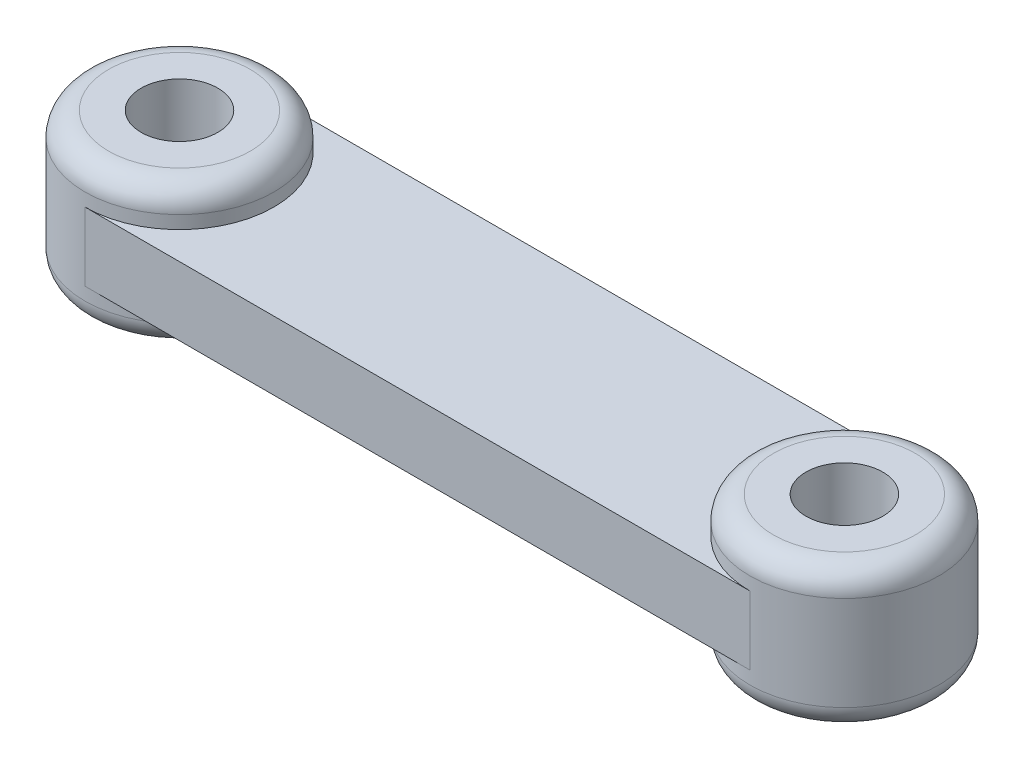
ISO-10303-21;
HEADER;
FILE_DESCRIPTION(('STEP AP214'),'2;1');
FILE_NAME('part.step','',(''),(''),'','','');
FILE_SCHEMA(('AUTOMOTIVE_DESIGN { 1 0 10303 214 1 1 1 1 }'));
ENDSEC;
DATA;
#1=APPLICATION_CONTEXT('core data for automotive mechanical design processes');
#2=APPLICATION_PROTOCOL_DEFINITION('international standard','automotive_design',2000,#1);
#3=PRODUCT_CONTEXT('',#1,'mechanical');
#4=PRODUCT('Part','Part','',(#3));
#5=PRODUCT_RELATED_PRODUCT_CATEGORY('part','',(#4));
#6=PRODUCT_DEFINITION_FORMATION('','',#4);
#7=PRODUCT_DEFINITION_CONTEXT('part definition',#1,'design');
#8=PRODUCT_DEFINITION('design','',#6,#7);
#9=PRODUCT_DEFINITION_SHAPE('','',#8);
#10=(LENGTH_UNIT() NAMED_UNIT(*) SI_UNIT(.MILLI.,.METRE.));
#11=(NAMED_UNIT(*) PLANE_ANGLE_UNIT() SI_UNIT($,.RADIAN.));
#12=(NAMED_UNIT(*) SI_UNIT($,.STERADIAN.) SOLID_ANGLE_UNIT());
#13=UNCERTAINTY_MEASURE_WITH_UNIT(LENGTH_MEASURE(1.E-05),#10,'distance_accuracy_value','');
#14=(GEOMETRIC_REPRESENTATION_CONTEXT(3) GLOBAL_UNCERTAINTY_ASSIGNED_CONTEXT((#13)) GLOBAL_UNIT_ASSIGNED_CONTEXT((#10,
#11,#12)) REPRESENTATION_CONTEXT('',''));
#15=CARTESIAN_POINT('',(0.,0.,0.));
#16=DIRECTION('',(0.,0.,1.));
#17=DIRECTION('',(1.,0.,0.));
#18=AXIS2_PLACEMENT_3D('',#15,#16,#17);
#19=CARTESIAN_POINT('',(-14.075,1.45,0.));
#20=DIRECTION('',(0.,1.,0.));
#21=DIRECTION('',(0.,0.,1.));
#22=AXIS2_PLACEMENT_3D('',#19,#20,#21);
#23=PLANE('',#22);
#24=DIRECTION('',(1.,0.,0.));
#25=VECTOR('',#24,1.);
#26=CARTESIAN_POINT('',(-14.075,1.45,4.));
#27=LINE('',#26,#25);
#28=CARTESIAN_POINT('',(-14.075,1.45,4.));
#29=VERTEX_POINT('',#28);
#30=CARTESIAN_POINT('',(14.075,1.45,3.99999999999999));
#31=VERTEX_POINT('',#30);
#32=EDGE_CURVE('E57',#29,#31,#27,.T.);
#33=ORIENTED_EDGE('',*,*,#32,.T.);
#34=CARTESIAN_POINT('',(14.075,1.45,0.));
#35=DIRECTION('',(0.,1.,0.));
#36=DIRECTION('',(0.,0.,1.));
#37=AXIS2_PLACEMENT_3D('',#34,#35,#36);
#38=CIRCLE('',#37,4.);
#39=CARTESIAN_POINT('',(14.075,1.45,-4.));
#40=VERTEX_POINT('',#39);
#41=EDGE_CURVE('E106',#31,#40,#38,.F.);
#42=ORIENTED_EDGE('',*,*,#41,.T.);
#43=DIRECTION('',(-1.,0.,0.));
#44=VECTOR('',#43,1.);
#45=CARTESIAN_POINT('',(-14.075,1.45,-4.));
#46=LINE('',#45,#44);
#47=CARTESIAN_POINT('',(-14.075,1.45,-4.));
#48=VERTEX_POINT('',#47);
#49=EDGE_CURVE('E161',#40,#48,#46,.T.);
#50=ORIENTED_EDGE('',*,*,#49,.T.);
#51=CARTESIAN_POINT('',(-14.075,1.45,0.));
#52=DIRECTION('',(0.,1.,0.));
#53=DIRECTION('',(0.,0.,1.));
#54=AXIS2_PLACEMENT_3D('',#51,#52,#53);
#55=CIRCLE('',#54,4.);
#56=EDGE_CURVE('E76',#48,#29,#55,.F.);
#57=ORIENTED_EDGE('',*,*,#56,.T.);
#58=EDGE_LOOP('',(#33,#42,#50,#57));
#59=FACE_BOUND('',#58,.T.);
#60=ADVANCED_FACE('F39',(#59),#23,.T.);
#61=CARTESIAN_POINT('',(-14.075,-1.45,0.));
#62=DIRECTION('',(0.,1.,0.));
#63=DIRECTION('',(0.,0.,1.));
#64=AXIS2_PLACEMENT_3D('',#61,#62,#63);
#65=PLANE('',#64);
#66=CARTESIAN_POINT('',(14.075,-1.45,0.));
#67=DIRECTION('',(0.,1.,0.));
#68=DIRECTION('',(0.,0.,1.));
#69=AXIS2_PLACEMENT_3D('',#66,#67,#68);
#70=CIRCLE('',#69,4.);
#71=CARTESIAN_POINT('',(14.075,-1.45,3.99999999999999));
#72=VERTEX_POINT('',#71);
#73=CARTESIAN_POINT('',(14.075,-1.45,-4.));
#74=VERTEX_POINT('',#73);
#75=EDGE_CURVE('E68',#72,#74,#70,.F.);
#76=ORIENTED_EDGE('',*,*,#75,.F.);
#77=DIRECTION('',(1.,0.,0.));
#78=VECTOR('',#77,1.);
#79=CARTESIAN_POINT('',(-14.075,-1.45,4.));
#80=LINE('',#79,#78);
#81=CARTESIAN_POINT('',(-14.075,-1.45,4.));
#82=VERTEX_POINT('',#81);
#83=EDGE_CURVE('E90',#82,#72,#80,.T.);
#84=ORIENTED_EDGE('',*,*,#83,.F.);
#85=CARTESIAN_POINT('',(-14.075,-1.45,0.));
#86=DIRECTION('',(0.,1.,0.));
#87=DIRECTION('',(0.,0.,1.));
#88=AXIS2_PLACEMENT_3D('',#85,#86,#87);
#89=CIRCLE('',#88,4.);
#90=CARTESIAN_POINT('',(-14.075,-1.45,-4.));
#91=VERTEX_POINT('',#90);
#92=EDGE_CURVE('E96',#91,#82,#89,.F.);
#93=ORIENTED_EDGE('',*,*,#92,.F.);
#94=DIRECTION('',(-1.,0.,0.));
#95=VECTOR('',#94,1.);
#96=CARTESIAN_POINT('',(-14.075,-1.45,-4.));
#97=LINE('',#96,#95);
#98=EDGE_CURVE('E93',#74,#91,#97,.T.);
#99=ORIENTED_EDGE('',*,*,#98,.F.);
#100=EDGE_LOOP('',(#76,#84,#93,#99));
#101=FACE_BOUND('',#100,.T.);
#102=ADVANCED_FACE('F89',(#101),#65,.F.);
#103=CARTESIAN_POINT('',(-14.075,1.45,0.));
#104=DIRECTION('',(0.,-1.,0.));
#105=DIRECTION('',(0.,0.,-1.));
#106=AXIS2_PLACEMENT_3D('',#103,#104,#105);
#107=CYLINDRICAL_SURFACE('',#106,4.);
#108=CARTESIAN_POINT('',(-14.075,-2.,0.));
#109=DIRECTION('',(0.,1.,0.));
#110=DIRECTION('',(0.,0.,1.));
#111=AXIS2_PLACEMENT_3D('',#108,#109,#110);
#112=CIRCLE('',#111,4.);
#113=CARTESIAN_POINT('',(-14.075,-2.,4.));
#114=VERTEX_POINT('',#113);
#115=EDGE_CURVE('E138',#114,#114,#112,.T.);
#116=ORIENTED_EDGE('',*,*,#115,.T.);
#117=EDGE_LOOP('',(#116));
#118=FACE_BOUND('',#117,.T.);
#119=CARTESIAN_POINT('',(-14.075,2.,0.));
#120=DIRECTION('',(0.,1.,0.));
#121=DIRECTION('',(0.,0.,1.));
#122=AXIS2_PLACEMENT_3D('',#119,#120,#121);
#123=CIRCLE('',#122,4.);
#124=CARTESIAN_POINT('',(-14.075,2.,4.));
#125=VERTEX_POINT('',#124);
#126=EDGE_CURVE('E134',#125,#125,#123,.F.);
#127=ORIENTED_EDGE('',*,*,#126,.T.);
#128=EDGE_LOOP('',(#127));
#129=FACE_BOUND('',#128,.T.);
#130=DIRECTION('',(0.,-1.,0.));
#131=VECTOR('',#130,1.);
#132=CARTESIAN_POINT('',(-14.075,1.45,-4.));
#133=LINE('',#132,#131);
#134=EDGE_CURVE('E113',#48,#91,#133,.T.);
#135=ORIENTED_EDGE('',*,*,#134,.T.);
#136=ORIENTED_EDGE('',*,*,#92,.T.);
#137=DIRECTION('',(0.,-1.,0.));
#138=VECTOR('',#137,1.);
#139=CARTESIAN_POINT('',(-14.075,1.45,4.));
#140=LINE('',#139,#138);
#141=EDGE_CURVE('E102',#29,#82,#140,.T.);
#142=ORIENTED_EDGE('',*,*,#141,.F.);
#143=ORIENTED_EDGE('',*,*,#56,.F.);
#144=EDGE_LOOP('',(#135,#136,#142,#143));
#145=FACE_BOUND('',#144,.T.);
#146=ADVANCED_FACE('F153',(#118,#129,#145),#107,.T.);
#147=CARTESIAN_POINT('',(-14.075,1.45,4.));
#148=DIRECTION('',(0.,0.,-1.));
#149=DIRECTION('',(-1.,0.,0.));
#150=AXIS2_PLACEMENT_3D('',#147,#148,#149);
#151=PLANE('',#150);
#152=ORIENTED_EDGE('',*,*,#83,.T.);
#153=DIRECTION('',(0.,-1.,0.));
#154=VECTOR('',#153,1.);
#155=CARTESIAN_POINT('',(14.075,1.45,3.99999999999999));
#156=LINE('',#155,#154);
#157=EDGE_CURVE('E100',#31,#72,#156,.T.);
#158=ORIENTED_EDGE('',*,*,#157,.F.);
#159=ORIENTED_EDGE('',*,*,#32,.F.);
#160=ORIENTED_EDGE('',*,*,#141,.T.);
#161=EDGE_LOOP('',(#152,#158,#159,#160));
#162=FACE_BOUND('',#161,.T.);
#163=ADVANCED_FACE('F99',(#162),#151,.F.);
#164=CARTESIAN_POINT('',(14.075,1.45,0.));
#165=DIRECTION('',(0.,-1.,0.));
#166=DIRECTION('',(0.,0.,-1.));
#167=AXIS2_PLACEMENT_3D('',#164,#165,#166);
#168=CYLINDRICAL_SURFACE('',#167,4.);
#169=CARTESIAN_POINT('',(14.075,2.,0.));
#170=DIRECTION('',(0.,1.,0.));
#171=DIRECTION('',(0.,0.,1.));
#172=AXIS2_PLACEMENT_3D('',#169,#170,#171);
#173=CIRCLE('',#172,4.);
#174=CARTESIAN_POINT('',(14.075,2.,3.99999999999999));
#175=VERTEX_POINT('',#174);
#176=EDGE_CURVE('E126',#175,#175,#173,.F.);
#177=ORIENTED_EDGE('',*,*,#176,.T.);
#178=EDGE_LOOP('',(#177));
#179=FACE_BOUND('',#178,.T.);
#180=CARTESIAN_POINT('',(14.075,-2.,0.));
#181=DIRECTION('',(0.,1.,0.));
#182=DIRECTION('',(0.,0.,1.));
#183=AXIS2_PLACEMENT_3D('',#180,#181,#182);
#184=CIRCLE('',#183,4.);
#185=CARTESIAN_POINT('',(14.075,-2.,3.99999999999999));
#186=VERTEX_POINT('',#185);
#187=EDGE_CURVE('E122',#186,#186,#184,.T.);
#188=ORIENTED_EDGE('',*,*,#187,.T.);
#189=EDGE_LOOP('',(#188));
#190=FACE_BOUND('',#189,.T.);
#191=ORIENTED_EDGE('',*,*,#157,.T.);
#192=ORIENTED_EDGE('',*,*,#75,.T.);
#193=DIRECTION('',(0.,-1.,0.));
#194=VECTOR('',#193,1.);
#195=CARTESIAN_POINT('',(14.075,1.45,-4.));
#196=LINE('',#195,#194);
#197=EDGE_CURVE('E108',#40,#74,#196,.T.);
#198=ORIENTED_EDGE('',*,*,#197,.F.);
#199=ORIENTED_EDGE('',*,*,#41,.F.);
#200=EDGE_LOOP('',(#191,#192,#198,#199));
#201=FACE_BOUND('',#200,.T.);
#202=ADVANCED_FACE('F105',(#179,#190,#201),#168,.T.);
#203=CARTESIAN_POINT('',(-14.075,1.45,-4.));
#204=DIRECTION('',(0.,0.,1.));
#205=DIRECTION('',(1.,0.,0.));
#206=AXIS2_PLACEMENT_3D('',#203,#204,#205);
#207=PLANE('',#206);
#208=ORIENTED_EDGE('',*,*,#98,.T.);
#209=ORIENTED_EDGE('',*,*,#134,.F.);
#210=ORIENTED_EDGE('',*,*,#49,.F.);
#211=ORIENTED_EDGE('',*,*,#197,.T.);
#212=EDGE_LOOP('',(#208,#209,#210,#211));
#213=FACE_BOUND('',#212,.T.);
#214=ADVANCED_FACE('F220',(#213),#207,.F.);
#215=CARTESIAN_POINT('',(-14.075,-3.,0.));
#216=DIRECTION('',(0.,1.,0.));
#217=DIRECTION('',(0.,0.,1.));
#218=AXIS2_PLACEMENT_3D('',#215,#216,#217);
#219=PLANE('',#218);
#220=CARTESIAN_POINT('',(-14.075,-3.,0.));
#221=DIRECTION('',(0.,1.,0.));
#222=DIRECTION('',(0.,0.,1.));
#223=AXIS2_PLACEMENT_3D('',#220,#221,#222);
#224=CIRCLE('',#223,1.625);
#225=CARTESIAN_POINT('',(-14.075,-3.,1.625));
#226=VERTEX_POINT('',#225);
#227=EDGE_CURVE('E173',#226,#226,#224,.T.);
#228=ORIENTED_EDGE('',*,*,#227,.T.);
#229=EDGE_LOOP('',(#228));
#230=FACE_BOUND('',#229,.T.);
#231=CARTESIAN_POINT('',(-14.075,-3.,0.));
#232=DIRECTION('',(0.,1.,0.));
#233=DIRECTION('',(0.,0.,1.));
#234=AXIS2_PLACEMENT_3D('',#231,#232,#233);
#235=CIRCLE('',#234,3.);
#236=CARTESIAN_POINT('',(-14.075,-3.,3.));
#237=VERTEX_POINT('',#236);
#238=EDGE_CURVE('E49',#237,#237,#235,.F.);
#239=ORIENTED_EDGE('',*,*,#238,.T.);
#240=EDGE_LOOP('',(#239));
#241=FACE_BOUND('',#240,.T.);
#242=ADVANCED_FACE('F145',(#230,#241),#219,.F.);
#243=CARTESIAN_POINT('',(-14.075,3.,0.));
#244=DIRECTION('',(0.,1.,0.));
#245=DIRECTION('',(0.,0.,1.));
#246=AXIS2_PLACEMENT_3D('',#243,#244,#245);
#247=PLANE('',#246);
#248=CARTESIAN_POINT('',(-14.075,3.,0.));
#249=DIRECTION('',(0.,1.,0.));
#250=DIRECTION('',(0.,0.,1.));
#251=AXIS2_PLACEMENT_3D('',#248,#249,#250);
#252=CIRCLE('',#251,1.625);
#253=CARTESIAN_POINT('',(-14.075,3.,1.625));
#254=VERTEX_POINT('',#253);
#255=EDGE_CURVE('E182',#254,#254,#252,.T.);
#256=ORIENTED_EDGE('',*,*,#255,.F.);
#257=EDGE_LOOP('',(#256));
#258=FACE_BOUND('',#257,.T.);
#259=CARTESIAN_POINT('',(-14.075,3.,0.));
#260=DIRECTION('',(0.,1.,0.));
#261=DIRECTION('',(0.,0.,1.));
#262=AXIS2_PLACEMENT_3D('',#259,#260,#261);
#263=CIRCLE('',#262,3.);
#264=CARTESIAN_POINT('',(-14.075,3.,3.));
#265=VERTEX_POINT('',#264);
#266=EDGE_CURVE('E11',#265,#265,#263,.T.);
#267=ORIENTED_EDGE('',*,*,#266,.T.);
#268=EDGE_LOOP('',(#267));
#269=FACE_BOUND('',#268,.T.);
#270=ADVANCED_FACE('F198',(#258,#269),#247,.T.);
#271=CARTESIAN_POINT('',(14.075,-3.,0.));
#272=DIRECTION('',(0.,1.,0.));
#273=DIRECTION('',(0.,0.,1.));
#274=AXIS2_PLACEMENT_3D('',#271,#272,#273);
#275=PLANE('',#274);
#276=CARTESIAN_POINT('',(14.075,-3.,0.));
#277=DIRECTION('',(0.,1.,0.));
#278=DIRECTION('',(0.,0.,1.));
#279=AXIS2_PLACEMENT_3D('',#276,#277,#278);
#280=CIRCLE('',#279,1.625);
#281=CARTESIAN_POINT('',(14.075,-3.,1.62499999999999));
#282=VERTEX_POINT('',#281);
#283=EDGE_CURVE('E178',#282,#282,#280,.T.);
#284=ORIENTED_EDGE('',*,*,#283,.T.);
#285=EDGE_LOOP('',(#284));
#286=FACE_BOUND('',#285,.T.);
#287=CARTESIAN_POINT('',(14.075,-3.,0.));
#288=DIRECTION('',(0.,1.,0.));
#289=DIRECTION('',(0.,0.,1.));
#290=AXIS2_PLACEMENT_3D('',#287,#288,#289);
#291=CIRCLE('',#290,3.);
#292=CARTESIAN_POINT('',(14.075,-3.,2.99999999999999));
#293=VERTEX_POINT('',#292);
#294=EDGE_CURVE('E130',#293,#293,#291,.F.);
#295=ORIENTED_EDGE('',*,*,#294,.T.);
#296=EDGE_LOOP('',(#295));
#297=FACE_BOUND('',#296,.T.);
#298=ADVANCED_FACE('F201',(#286,#297),#275,.F.);
#299=CARTESIAN_POINT('',(14.075,3.,0.));
#300=DIRECTION('',(0.,1.,0.));
#301=DIRECTION('',(0.,0.,1.));
#302=AXIS2_PLACEMENT_3D('',#299,#300,#301);
#303=PLANE('',#302);
#304=CARTESIAN_POINT('',(14.075,3.,0.));
#305=DIRECTION('',(0.,1.,0.));
#306=DIRECTION('',(0.,0.,1.));
#307=AXIS2_PLACEMENT_3D('',#304,#305,#306);
#308=CIRCLE('',#307,1.625);
#309=CARTESIAN_POINT('',(14.075,3.,1.62499999999999));
#310=VERTEX_POINT('',#309);
#311=EDGE_CURVE('E174',#310,#310,#308,.T.);
#312=ORIENTED_EDGE('',*,*,#311,.F.);
#313=EDGE_LOOP('',(#312));
#314=FACE_BOUND('',#313,.T.);
#315=CARTESIAN_POINT('',(14.075,3.,0.));
#316=DIRECTION('',(0.,1.,0.));
#317=DIRECTION('',(0.,0.,1.));
#318=AXIS2_PLACEMENT_3D('',#315,#316,#317);
#319=CIRCLE('',#318,3.);
#320=CARTESIAN_POINT('',(14.075,3.,2.99999999999999));
#321=VERTEX_POINT('',#320);
#322=EDGE_CURVE('E95',#321,#321,#319,.T.);
#323=ORIENTED_EDGE('',*,*,#322,.T.);
#324=EDGE_LOOP('',(#323));
#325=FACE_BOUND('',#324,.T.);
#326=ADVANCED_FACE('F231',(#314,#325),#303,.T.);
#327=CARTESIAN_POINT('',(14.075,2.,0.));
#328=DIRECTION('',(0.,1.,0.));
#329=DIRECTION('',(0.,0.,1.));
#330=AXIS2_PLACEMENT_3D('',#327,#328,#329);
#331=TOROIDAL_SURFACE('',#330,3.,1.);
#332=ORIENTED_EDGE('',*,*,#176,.F.);
#333=EDGE_LOOP('',(#332));
#334=FACE_BOUND('',#333,.T.);
#335=ORIENTED_EDGE('',*,*,#322,.F.);
#336=EDGE_LOOP('',(#335));
#337=FACE_BOUND('',#336,.T.);
#338=ADVANCED_FACE('F228',(#334,#337),#331,.T.);
#339=CARTESIAN_POINT('',(14.075,-2.,0.));
#340=DIRECTION('',(0.,1.,0.));
#341=DIRECTION('',(0.,0.,1.));
#342=AXIS2_PLACEMENT_3D('',#339,#340,#341);
#343=TOROIDAL_SURFACE('',#342,3.,1.);
#344=ORIENTED_EDGE('',*,*,#294,.F.);
#345=EDGE_LOOP('',(#344));
#346=FACE_BOUND('',#345,.T.);
#347=ORIENTED_EDGE('',*,*,#187,.F.);
#348=EDGE_LOOP('',(#347));
#349=FACE_BOUND('',#348,.T.);
#350=ADVANCED_FACE('F150',(#346,#349),#343,.T.);
#351=CARTESIAN_POINT('',(-14.075,-2.,0.));
#352=DIRECTION('',(0.,1.,0.));
#353=DIRECTION('',(0.,0.,1.));
#354=AXIS2_PLACEMENT_3D('',#351,#352,#353);
#355=TOROIDAL_SURFACE('',#354,3.,1.);
#356=ORIENTED_EDGE('',*,*,#238,.F.);
#357=EDGE_LOOP('',(#356));
#358=FACE_BOUND('',#357,.T.);
#359=ORIENTED_EDGE('',*,*,#115,.F.);
#360=EDGE_LOOP('',(#359));
#361=FACE_BOUND('',#360,.T.);
#362=ADVANCED_FACE('F147',(#358,#361),#355,.T.);
#363=CARTESIAN_POINT('',(-14.075,2.,0.));
#364=DIRECTION('',(0.,1.,0.));
#365=DIRECTION('',(0.,0.,1.));
#366=AXIS2_PLACEMENT_3D('',#363,#364,#365);
#367=TOROIDAL_SURFACE('',#366,3.,1.);
#368=ORIENTED_EDGE('',*,*,#126,.F.);
#369=EDGE_LOOP('',(#368));
#370=FACE_BOUND('',#369,.T.);
#371=ORIENTED_EDGE('',*,*,#266,.F.);
#372=EDGE_LOOP('',(#371));
#373=FACE_BOUND('',#372,.T.);
#374=ADVANCED_FACE('F41',(#370,#373),#367,.T.);
#375=CARTESIAN_POINT('',(14.075,-3.,0.));
#376=DIRECTION('',(0.,1.,0.));
#377=DIRECTION('',(0.,0.,1.));
#378=AXIS2_PLACEMENT_3D('',#375,#376,#377);
#379=CYLINDRICAL_SURFACE('',#378,1.625);
#380=ORIENTED_EDGE('',*,*,#283,.F.);
#381=EDGE_LOOP('',(#380));
#382=FACE_BOUND('',#381,.T.);
#383=ORIENTED_EDGE('',*,*,#311,.T.);
#384=EDGE_LOOP('',(#383));
#385=FACE_BOUND('',#384,.T.);
#386=ADVANCED_FACE('F194',(#382,#385),#379,.F.);
#387=CARTESIAN_POINT('',(-14.075,-3.,0.));
#388=DIRECTION('',(0.,1.,0.));
#389=DIRECTION('',(0.,0.,1.));
#390=AXIS2_PLACEMENT_3D('',#387,#388,#389);
#391=CYLINDRICAL_SURFACE('',#390,1.625);
#392=ORIENTED_EDGE('',*,*,#227,.F.);
#393=EDGE_LOOP('',(#392));
#394=FACE_BOUND('',#393,.T.);
#395=ORIENTED_EDGE('',*,*,#255,.T.);
#396=EDGE_LOOP('',(#395));
#397=FACE_BOUND('',#396,.T.);
#398=ADVANCED_FACE('F191',(#394,#397),#391,.F.);
#399=CLOSED_SHELL('',(#60,#102,#146,#163,#202,#214,#242,#270,#298,#326,#338,#350,#362,#374,#386,#398));
#400=MANIFOLD_SOLID_BREP('B2',#399);
#401=ADVANCED_BREP_SHAPE_REPRESENTATION('',(#18,#400),#14);
#402=SHAPE_DEFINITION_REPRESENTATION(#9,#401);
ENDSEC;
END-ISO-10303-21;
